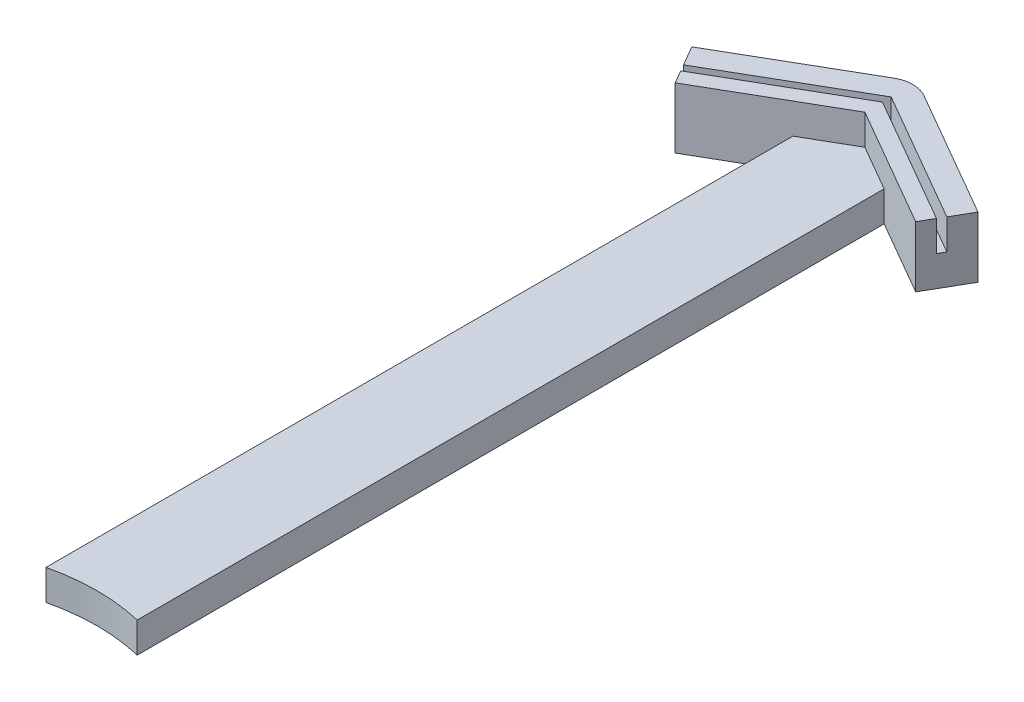
ISO-10303-21;
HEADER;
FILE_DESCRIPTION(('STEP AP214'),'2;1');
FILE_NAME('part.step','',(''),(''),'','','');
FILE_SCHEMA(('AUTOMOTIVE_DESIGN { 1 0 10303 214 1 1 1 1 }'));
ENDSEC;
DATA;
#1=APPLICATION_CONTEXT('core data for automotive mechanical design processes');
#2=APPLICATION_PROTOCOL_DEFINITION('international standard','automotive_design',2000,#1);
#3=PRODUCT_CONTEXT('',#1,'mechanical');
#4=PRODUCT('Part','Part','',(#3));
#5=PRODUCT_RELATED_PRODUCT_CATEGORY('part','',(#4));
#6=PRODUCT_DEFINITION_FORMATION('','',#4);
#7=PRODUCT_DEFINITION_CONTEXT('part definition',#1,'design');
#8=PRODUCT_DEFINITION('design','',#6,#7);
#9=PRODUCT_DEFINITION_SHAPE('','',#8);
#10=(LENGTH_UNIT() NAMED_UNIT(*) SI_UNIT(.MILLI.,.METRE.));
#11=(NAMED_UNIT(*) PLANE_ANGLE_UNIT() SI_UNIT($,.RADIAN.));
#12=(NAMED_UNIT(*) SI_UNIT($,.STERADIAN.) SOLID_ANGLE_UNIT());
#13=UNCERTAINTY_MEASURE_WITH_UNIT(LENGTH_MEASURE(1.E-05),#10,'distance_accuracy_value','');
#14=(GEOMETRIC_REPRESENTATION_CONTEXT(3) GLOBAL_UNCERTAINTY_ASSIGNED_CONTEXT((#13)) GLOBAL_UNIT_ASSIGNED_CONTEXT((#10,
#11,#12)) REPRESENTATION_CONTEXT('',''));
#15=CARTESIAN_POINT('',(0.,0.,0.));
#16=DIRECTION('',(0.,0.,1.));
#17=DIRECTION('',(1.,0.,0.));
#18=AXIS2_PLACEMENT_3D('',#15,#16,#17);
#19=CARTESIAN_POINT('',(0.,20.,34.6410161513775));
#20=DIRECTION('',(0.499999999999998,0.,-0.86602540378444));
#21=DIRECTION('',(-0.86602540378444,0.,-0.499999999999998));
#22=AXIS2_PLACEMENT_3D('',#19,#20,#21);
#23=PLANE('',#22);
#24=DIRECTION('',(0.86602540378444,0.,0.499999999999998));
#25=VECTOR('',#24,1.);
#26=CARTESIAN_POINT('',(0.,0.,34.6410161513775));
#27=LINE('',#26,#25);
#28=CARTESIAN_POINT('',(0.,0.,34.6410161513775));
#29=VERTEX_POINT('',#28);
#30=CARTESIAN_POINT('',(30.,0.,51.9615242270662));
#31=VERTEX_POINT('',#30);
#32=EDGE_CURVE('E120',#29,#31,#27,.T.);
#33=ORIENTED_EDGE('',*,*,#32,.F.);
#34=DIRECTION('',(0.,-1.,0.));
#35=VECTOR('',#34,1.);
#36=CARTESIAN_POINT('',(0.,20.,34.6410161513775));
#37=LINE('',#36,#35);
#38=CARTESIAN_POINT('',(0.,20.,34.6410161513775));
#39=VERTEX_POINT('',#38);
#40=EDGE_CURVE('E12',#39,#29,#37,.T.);
#41=ORIENTED_EDGE('',*,*,#40,.F.);
#42=DIRECTION('',(0.86602540378444,0.,0.499999999999998));
#43=VECTOR('',#42,1.);
#44=CARTESIAN_POINT('',(0.,20.,34.6410161513775));
#45=LINE('',#44,#43);
#46=CARTESIAN_POINT('',(30.,20.,51.9615242270662));
#47=VERTEX_POINT('',#46);
#48=EDGE_CURVE('E115',#39,#47,#45,.T.);
#49=ORIENTED_EDGE('',*,*,#48,.T.);
#50=DIRECTION('',(0.,-1.,0.));
#51=VECTOR('',#50,1.);
#52=CARTESIAN_POINT('',(30.,20.,51.9615242270662));
#53=LINE('',#52,#51);
#54=EDGE_CURVE('E46',#47,#31,#53,.T.);
#55=ORIENTED_EDGE('',*,*,#54,.T.);
#56=EDGE_LOOP('',(#33,#41,#49,#55));
#57=FACE_BOUND('',#56,.T.);
#58=ADVANCED_FACE('F43',(#57),#23,.T.);
#59=CARTESIAN_POINT('',(-30.,20.,51.9615242270662));
#60=DIRECTION('',(-0.499999999999998,0.,-0.86602540378444));
#61=DIRECTION('',(-0.86602540378444,0.,0.499999999999998));
#62=AXIS2_PLACEMENT_3D('',#59,#60,#61);
#63=PLANE('',#62);
#64=DIRECTION('',(0.86602540378444,0.,-0.499999999999998));
#65=VECTOR('',#64,1.);
#66=CARTESIAN_POINT('',(-30.,0.,51.9615242270662));
#67=LINE('',#66,#65);
#68=CARTESIAN_POINT('',(-30.,0.,51.9615242270662));
#69=VERTEX_POINT('',#68);
#70=EDGE_CURVE('E129',#69,#29,#67,.T.);
#71=ORIENTED_EDGE('',*,*,#70,.F.);
#72=DIRECTION('',(0.,-1.,0.));
#73=VECTOR('',#72,1.);
#74=CARTESIAN_POINT('',(-30.,20.,51.9615242270662));
#75=LINE('',#74,#73);
#76=CARTESIAN_POINT('',(-30.,20.,51.9615242270662));
#77=VERTEX_POINT('',#76);
#78=EDGE_CURVE('E52',#77,#69,#75,.T.);
#79=ORIENTED_EDGE('',*,*,#78,.F.);
#80=DIRECTION('',(0.86602540378444,0.,-0.499999999999998));
#81=VECTOR('',#80,1.);
#82=CARTESIAN_POINT('',(-30.,20.,51.9615242270662));
#83=LINE('',#82,#81);
#84=EDGE_CURVE('E110',#77,#39,#83,.T.);
#85=ORIENTED_EDGE('',*,*,#84,.T.);
#86=ORIENTED_EDGE('',*,*,#40,.T.);
#87=EDGE_LOOP('',(#71,#79,#85,#86));
#88=FACE_BOUND('',#87,.T.);
#89=ADVANCED_FACE('F135',(#88),#63,.T.);
#90=CARTESIAN_POINT('',(-30.,20.,51.9615242270662));
#91=DIRECTION('',(-1.,0.,0.));
#92=DIRECTION('',(0.,0.,1.));
#93=AXIS2_PLACEMENT_3D('',#90,#91,#92);
#94=PLANE('',#93);
#95=DIRECTION('',(0.,0.,-1.));
#96=VECTOR('',#95,1.);
#97=CARTESIAN_POINT('',(-30.,0.,51.9615242270662));
#98=LINE('',#97,#96);
#99=CARTESIAN_POINT('',(-30.,0.,543.23520585323));
#100=VERTEX_POINT('',#99);
#101=EDGE_CURVE('E99',#100,#69,#98,.T.);
#102=ORIENTED_EDGE('',*,*,#101,.F.);
#103=DIRECTION('',(0.,-1.,0.));
#104=VECTOR('',#103,1.);
#105=CARTESIAN_POINT('',(-30.,20.,543.23520585323));
#106=LINE('',#105,#104);
#107=CARTESIAN_POINT('',(-30.,20.,543.23520585323));
#108=VERTEX_POINT('',#107);
#109=EDGE_CURVE('E94',#108,#100,#106,.T.);
#110=ORIENTED_EDGE('',*,*,#109,.F.);
#111=DIRECTION('',(0.,0.,-1.));
#112=VECTOR('',#111,1.);
#113=CARTESIAN_POINT('',(-30.,20.,51.9615242270662));
#114=LINE('',#113,#112);
#115=EDGE_CURVE('E97',#108,#77,#114,.T.);
#116=ORIENTED_EDGE('',*,*,#115,.T.);
#117=ORIENTED_EDGE('',*,*,#78,.T.);
#118=EDGE_LOOP('',(#102,#110,#116,#117));
#119=FACE_BOUND('',#118,.T.);
#120=ADVANCED_FACE('F96',(#119),#94,.T.);
#121=CARTESIAN_POINT('',(0.,20.,669.726312259965));
#122=DIRECTION('',(0.,-1.,0.));
#123=DIRECTION('',(0.,0.,-1.));
#124=AXIS2_PLACEMENT_3D('',#121,#122,#123);
#125=CYLINDRICAL_SURFACE('',#124,130.);
#126=CARTESIAN_POINT('',(0.,0.,669.726312259965));
#127=DIRECTION('',(0.,1.,0.));
#128=DIRECTION('',(0.,0.,-1.));
#129=AXIS2_PLACEMENT_3D('',#126,#127,#128);
#130=CIRCLE('',#129,130.);
#131=CARTESIAN_POINT('',(30.,0.,543.23520585323));
#132=VERTEX_POINT('',#131);
#133=EDGE_CURVE('E126',#132,#100,#130,.T.);
#134=ORIENTED_EDGE('',*,*,#133,.F.);
#135=DIRECTION('',(0.,-1.,0.));
#136=VECTOR('',#135,1.);
#137=CARTESIAN_POINT('',(30.,20.,543.23520585323));
#138=LINE('',#137,#136);
#139=CARTESIAN_POINT('',(30.,20.,543.23520585323));
#140=VERTEX_POINT('',#139);
#141=EDGE_CURVE('E104',#140,#132,#138,.T.);
#142=ORIENTED_EDGE('',*,*,#141,.F.);
#143=CARTESIAN_POINT('',(0.,20.,669.726312259965));
#144=DIRECTION('',(0.,1.,0.));
#145=DIRECTION('',(0.,0.,-1.));
#146=AXIS2_PLACEMENT_3D('',#143,#144,#145);
#147=CIRCLE('',#146,130.);
#148=EDGE_CURVE('E109',#140,#108,#147,.T.);
#149=ORIENTED_EDGE('',*,*,#148,.T.);
#150=ORIENTED_EDGE('',*,*,#109,.T.);
#151=EDGE_LOOP('',(#134,#142,#149,#150));
#152=FACE_BOUND('',#151,.T.);
#153=ADVANCED_FACE('F112',(#152),#125,.F.);
#154=CARTESIAN_POINT('',(30.,20.,51.9615242270662));
#155=DIRECTION('',(1.,0.,0.));
#156=DIRECTION('',(0.,0.,-1.));
#157=AXIS2_PLACEMENT_3D('',#154,#155,#156);
#158=PLANE('',#157);
#159=DIRECTION('',(0.,0.,1.));
#160=VECTOR('',#159,1.);
#161=CARTESIAN_POINT('',(30.,0.,51.9615242270662));
#162=LINE('',#161,#160);
#163=EDGE_CURVE('E123',#31,#132,#162,.T.);
#164=ORIENTED_EDGE('',*,*,#163,.F.);
#165=ORIENTED_EDGE('',*,*,#54,.F.);
#166=DIRECTION('',(0.,0.,1.));
#167=VECTOR('',#166,1.);
#168=CARTESIAN_POINT('',(30.,20.,51.9615242270662));
#169=LINE('',#168,#167);
#170=EDGE_CURVE('E113',#47,#140,#169,.T.);
#171=ORIENTED_EDGE('',*,*,#170,.T.);
#172=ORIENTED_EDGE('',*,*,#141,.T.);
#173=EDGE_LOOP('',(#164,#165,#171,#172));
#174=FACE_BOUND('',#173,.T.);
#175=ADVANCED_FACE('F132',(#174),#158,.T.);
#176=CARTESIAN_POINT('',(0.,20.,669.726312259965));
#177=DIRECTION('',(0.,-1.,0.));
#178=DIRECTION('',(0.,0.,-1.));
#179=AXIS2_PLACEMENT_3D('',#176,#177,#178);
#180=PLANE('',#179);
#181=ORIENTED_EDGE('',*,*,#48,.F.);
#182=ORIENTED_EDGE('',*,*,#84,.F.);
#183=ORIENTED_EDGE('',*,*,#115,.F.);
#184=ORIENTED_EDGE('',*,*,#148,.F.);
#185=ORIENTED_EDGE('',*,*,#170,.F.);
#186=EDGE_LOOP('',(#181,#182,#183,#184,#185));
#187=FACE_BOUND('',#186,.T.);
#188=ADVANCED_FACE('F108',(#187),#180,.F.);
#189=CARTESIAN_POINT('',(0.,0.,669.726312259965));
#190=DIRECTION('',(0.,-1.,0.));
#191=DIRECTION('',(0.,0.,-1.));
#192=AXIS2_PLACEMENT_3D('',#189,#190,#191);
#193=PLANE('',#192);
#194=ORIENTED_EDGE('',*,*,#32,.T.);
#195=ORIENTED_EDGE('',*,*,#163,.T.);
#196=ORIENTED_EDGE('',*,*,#133,.T.);
#197=ORIENTED_EDGE('',*,*,#101,.T.);
#198=ORIENTED_EDGE('',*,*,#70,.T.);
#199=EDGE_LOOP('',(#194,#195,#196,#197,#198));
#200=FACE_BOUND('',#199,.T.);
#201=ADVANCED_FACE('F134',(#200),#193,.T.);
#202=CLOSED_SHELL('',(#58,#89,#120,#153,#175,#188,#201));
#203=MANIFOLD_SOLID_BREP('B2',#202);
#204=CARTESIAN_POINT('',(0.,40.,23.094010767585));
#205=DIRECTION('',(0.,1.,0.));
#206=DIRECTION('',(0.,0.,1.));
#207=AXIS2_PLACEMENT_3D('',#204,#205,#206);
#208=PLANE('',#207);
#209=DIRECTION('',(-0.866025403784439,0.,0.5));
#210=VECTOR('',#209,1.);
#211=CARTESIAN_POINT('',(-86.6027603816707,40.,67.3206350946107));
#212=LINE('',#211,#210);
#213=CARTESIAN_POINT('',(-2.20743562318049E-13,40.,17.3205080756886));
#214=VERTEX_POINT('',#213);
#215=CARTESIAN_POINT('',(-86.6027603816707,40.,67.3206350946107));
#216=VERTEX_POINT('',#215);
#217=EDGE_CURVE('E343',#214,#216,#212,.T.);
#218=ORIENTED_EDGE('',*,*,#217,.F.);
#219=DIRECTION('',(-0.86602540378444,0.,-0.499999999999998));
#220=VECTOR('',#219,1.);
#221=CARTESIAN_POINT('',(-2.20743562318049E-13,40.,17.3205080756886));
#222=LINE('',#221,#220);
#223=CARTESIAN_POINT('',(86.6027603816707,40.,67.3206350946107));
#224=VERTEX_POINT('',#223);
#225=EDGE_CURVE('E406',#224,#214,#222,.T.);
#226=ORIENTED_EDGE('',*,*,#225,.F.);
#227=DIRECTION('',(0.499999999999998,0.,-0.86602540378444));
#228=VECTOR('',#227,1.);
#229=CARTESIAN_POINT('',(79.1027603816707,40.,80.3110161513773));
#230=LINE('',#229,#228);
#231=CARTESIAN_POINT('',(94.1027603816707,40.,54.3302540378441));
#232=VERTEX_POINT('',#231);
#233=EDGE_CURVE('E256',#224,#232,#230,.T.);
#234=ORIENTED_EDGE('',*,*,#233,.T.);
#235=DIRECTION('',(-0.86602540378444,0.,-0.499999999999998));
#236=VECTOR('',#235,1.);
#237=CARTESIAN_POINT('',(10.,40.,5.77350269189625));
#238=LINE('',#237,#236);
#239=CARTESIAN_POINT('',(10.,40.,5.77350269189625));
#240=VERTEX_POINT('',#239);
#241=EDGE_CURVE('E417',#232,#240,#238,.T.);
#242=ORIENTED_EDGE('',*,*,#241,.T.);
#243=CARTESIAN_POINT('',(0.,40.,23.094010767585));
#244=DIRECTION('',(0.,1.,0.));
#245=DIRECTION('',(0.,0.,1.));
#246=AXIS2_PLACEMENT_3D('',#243,#244,#245);
#247=CIRCLE('',#246,20.);
#248=CARTESIAN_POINT('',(-10.,40.,5.77350269189625));
#249=VERTEX_POINT('',#248);
#250=EDGE_CURVE('E327',#240,#249,#247,.T.);
#251=ORIENTED_EDGE('',*,*,#250,.T.);
#252=DIRECTION('',(-0.86602540378444,0.,0.499999999999998));
#253=VECTOR('',#252,1.);
#254=CARTESIAN_POINT('',(-10.,40.,5.77350269189625));
#255=LINE('',#254,#253);
#256=CARTESIAN_POINT('',(-94.1027603816707,40.,54.3302540378441));
#257=VERTEX_POINT('',#256);
#258=EDGE_CURVE('E280',#249,#257,#255,.T.);
#259=ORIENTED_EDGE('',*,*,#258,.T.);
#260=DIRECTION('',(0.499999999999999,0.,0.866025403784439));
#261=VECTOR('',#260,1.);
#262=CARTESIAN_POINT('',(-94.1027603816707,40.,54.3302540378441));
#263=LINE('',#262,#261);
#264=EDGE_CURVE('E279',#257,#216,#263,.T.);
#265=ORIENTED_EDGE('',*,*,#264,.T.);
#266=EDGE_LOOP('',(#218,#226,#234,#242,#251,#259,#265));
#267=FACE_BOUND('',#266,.T.);
#268=ADVANCED_FACE('F193',(#267),#208,.T.);
#269=CARTESIAN_POINT('',(79.1027603816707,40.,80.3110161513773));
#270=DIRECTION('',(-0.86602540378444,0.,-0.499999999999998));
#271=DIRECTION('',(-0.499999999999998,0.,0.86602540378444));
#272=AXIS2_PLACEMENT_3D('',#269,#270,#271);
#273=PLANE('',#272);
#274=ORIENTED_EDGE('',*,*,#233,.F.);
#275=DIRECTION('',(0.,1.,0.));
#276=VECTOR('',#275,1.);
#277=CARTESIAN_POINT('',(86.6027603816707,20.,67.3206350946107));
#278=LINE('',#277,#276);
#279=CARTESIAN_POINT('',(86.6027603816707,20.,67.3206350946107));
#280=VERTEX_POINT('',#279);
#281=EDGE_CURVE('E411',#280,#224,#278,.T.);
#282=ORIENTED_EDGE('',*,*,#281,.F.);
#283=DIRECTION('',(0.500000000000001,0.,-0.866025403784438));
#284=VECTOR('',#283,1.);
#285=CARTESIAN_POINT('',(84.1027603816707,20.,71.6507621135329));
#286=LINE('',#285,#284);
#287=CARTESIAN_POINT('',(84.1027603816707,20.,71.6507621135329));
#288=VERTEX_POINT('',#287);
#289=EDGE_CURVE('E389',#288,#280,#286,.T.);
#290=ORIENTED_EDGE('',*,*,#289,.F.);
#291=DIRECTION('',(0.,1.,0.));
#292=VECTOR('',#291,1.);
#293=CARTESIAN_POINT('',(84.1027603816707,20.,71.6507621135329));
#294=LINE('',#293,#292);
#295=CARTESIAN_POINT('',(84.1027603816707,40.,71.6507621135329));
#296=VERTEX_POINT('',#295);
#297=EDGE_CURVE('E380',#288,#296,#294,.T.);
#298=ORIENTED_EDGE('',*,*,#297,.T.);
#299=CARTESIAN_POINT('',(79.1027603816707,40.,80.3110161513773));
#300=VERTEX_POINT('',#299);
#301=EDGE_CURVE('E415',#300,#296,#230,.T.);
#302=ORIENTED_EDGE('',*,*,#301,.F.);
#303=DIRECTION('',(0.,-1.,0.));
#304=VECTOR('',#303,1.);
#305=CARTESIAN_POINT('',(79.1027603816707,40.,80.3110161513773));
#306=LINE('',#305,#304);
#307=CARTESIAN_POINT('',(79.1027603816707,0.,80.3110161513773));
#308=VERTEX_POINT('',#307);
#309=EDGE_CURVE('E296',#300,#308,#306,.T.);
#310=ORIENTED_EDGE('',*,*,#309,.T.);
#311=DIRECTION('',(0.499999999999998,0.,-0.86602540378444));
#312=VECTOR('',#311,1.);
#313=CARTESIAN_POINT('',(79.1027603816707,0.,80.3110161513773));
#314=LINE('',#313,#312);
#315=CARTESIAN_POINT('',(94.1027603816707,0.,54.3302540378441));
#316=VERTEX_POINT('',#315);
#317=EDGE_CURVE('E301',#308,#316,#314,.T.);
#318=ORIENTED_EDGE('',*,*,#317,.T.);
#319=DIRECTION('',(0.,-1.,0.));
#320=VECTOR('',#319,1.);
#321=CARTESIAN_POINT('',(94.1027603816707,40.,54.3302540378441));
#322=LINE('',#321,#320);
#323=EDGE_CURVE('E41',#232,#316,#322,.T.);
#324=ORIENTED_EDGE('',*,*,#323,.F.);
#325=EDGE_LOOP('',(#274,#282,#290,#298,#302,#310,#318,#324));
#326=FACE_BOUND('',#325,.T.);
#327=ADVANCED_FACE('F195',(#326),#273,.F.);
#328=CARTESIAN_POINT('',(10.,40.,5.77350269189625));
#329=DIRECTION('',(-0.499999999999998,0.,0.86602540378444));
#330=DIRECTION('',(0.86602540378444,0.,0.499999999999998));
#331=AXIS2_PLACEMENT_3D('',#328,#329,#330);
#332=PLANE('',#331);
#333=DIRECTION('',(-0.86602540378444,0.,-0.499999999999998));
#334=VECTOR('',#333,1.);
#335=CARTESIAN_POINT('',(10.,0.,5.77350269189625));
#336=LINE('',#335,#334);
#337=CARTESIAN_POINT('',(10.,0.,5.77350269189625));
#338=VERTEX_POINT('',#337);
#339=EDGE_CURVE('E304',#316,#338,#336,.T.);
#340=ORIENTED_EDGE('',*,*,#339,.T.);
#341=DIRECTION('',(0.,-1.,0.));
#342=VECTOR('',#341,1.);
#343=CARTESIAN_POINT('',(10.,40.,5.77350269189625));
#344=LINE('',#343,#342);
#345=EDGE_CURVE('E201',#240,#338,#344,.T.);
#346=ORIENTED_EDGE('',*,*,#345,.F.);
#347=ORIENTED_EDGE('',*,*,#241,.F.);
#348=ORIENTED_EDGE('',*,*,#323,.T.);
#349=EDGE_LOOP('',(#340,#346,#347,#348));
#350=FACE_BOUND('',#349,.T.);
#351=ADVANCED_FACE('F420',(#350),#332,.F.);
#352=CARTESIAN_POINT('',(0.,40.,23.094010767585));
#353=DIRECTION('',(0.,-1.,0.));
#354=DIRECTION('',(0.,0.,-1.));
#355=AXIS2_PLACEMENT_3D('',#352,#353,#354);
#356=CYLINDRICAL_SURFACE('',#355,20.);
#357=CARTESIAN_POINT('',(0.,0.,23.094010767585));
#358=DIRECTION('',(0.,1.,0.));
#359=DIRECTION('',(0.,0.,1.));
#360=AXIS2_PLACEMENT_3D('',#357,#358,#359);
#361=CIRCLE('',#360,20.);
#362=CARTESIAN_POINT('',(-10.,0.,5.77350269189625));
#363=VERTEX_POINT('',#362);
#364=EDGE_CURVE('E307',#338,#363,#361,.T.);
#365=ORIENTED_EDGE('',*,*,#364,.T.);
#366=DIRECTION('',(0.,-1.,0.));
#367=VECTOR('',#366,1.);
#368=CARTESIAN_POINT('',(-10.,40.,5.77350269189625));
#369=LINE('',#368,#367);
#370=EDGE_CURVE('E318',#249,#363,#369,.T.);
#371=ORIENTED_EDGE('',*,*,#370,.F.);
#372=ORIENTED_EDGE('',*,*,#250,.F.);
#373=ORIENTED_EDGE('',*,*,#345,.T.);
#374=EDGE_LOOP('',(#365,#371,#372,#373));
#375=FACE_BOUND('',#374,.T.);
#376=ADVANCED_FACE('F325',(#375),#356,.T.);
#377=CARTESIAN_POINT('',(-10.,40.,5.77350269189625));
#378=DIRECTION('',(0.499999999999998,0.,0.86602540378444));
#379=DIRECTION('',(0.86602540378444,0.,-0.499999999999998));
#380=AXIS2_PLACEMENT_3D('',#377,#378,#379);
#381=PLANE('',#380);
#382=DIRECTION('',(-0.86602540378444,0.,0.499999999999998));
#383=VECTOR('',#382,1.);
#384=CARTESIAN_POINT('',(-10.,0.,5.77350269189625));
#385=LINE('',#384,#383);
#386=CARTESIAN_POINT('',(-94.1027603816707,0.,54.3302540378441));
#387=VERTEX_POINT('',#386);
#388=EDGE_CURVE('E309',#363,#387,#385,.T.);
#389=ORIENTED_EDGE('',*,*,#388,.T.);
#390=DIRECTION('',(0.,-1.,0.));
#391=VECTOR('',#390,1.);
#392=CARTESIAN_POINT('',(-94.1027603816707,40.,54.3302540378441));
#393=LINE('',#392,#391);
#394=EDGE_CURVE('E291',#257,#387,#393,.T.);
#395=ORIENTED_EDGE('',*,*,#394,.F.);
#396=ORIENTED_EDGE('',*,*,#258,.F.);
#397=ORIENTED_EDGE('',*,*,#370,.T.);
#398=EDGE_LOOP('',(#389,#395,#396,#397));
#399=FACE_BOUND('',#398,.T.);
#400=ADVANCED_FACE('F335',(#399),#381,.F.);
#401=CARTESIAN_POINT('',(-94.1027603816707,40.,54.3302540378441));
#402=DIRECTION('',(0.866025403784439,0.,-0.499999999999999));
#403=DIRECTION('',(-0.499999999999999,0.,-0.866025403784439));
#404=AXIS2_PLACEMENT_3D('',#401,#402,#403);
#405=PLANE('',#404);
#406=DIRECTION('',(0.5,0.,0.866025403784439));
#407=VECTOR('',#406,1.);
#408=CARTESIAN_POINT('',(-84.1027603816707,20.,71.6507621135329));
#409=LINE('',#408,#407);
#410=CARTESIAN_POINT('',(-86.6027603816707,20.,67.3206350946107));
#411=VERTEX_POINT('',#410);
#412=CARTESIAN_POINT('',(-84.1027603816707,20.,71.6507621135329));
#413=VERTEX_POINT('',#412);
#414=EDGE_CURVE('E393',#411,#413,#409,.T.);
#415=ORIENTED_EDGE('',*,*,#414,.F.);
#416=DIRECTION('',(0.,1.,0.));
#417=VECTOR('',#416,1.);
#418=CARTESIAN_POINT('',(-86.6027603816707,20.,67.3206350946107));
#419=LINE('',#418,#417);
#420=EDGE_CURVE('E305',#411,#216,#419,.T.);
#421=ORIENTED_EDGE('',*,*,#420,.T.);
#422=ORIENTED_EDGE('',*,*,#264,.F.);
#423=ORIENTED_EDGE('',*,*,#394,.T.);
#424=DIRECTION('',(0.499999999999999,0.,0.866025403784439));
#425=VECTOR('',#424,1.);
#426=CARTESIAN_POINT('',(-94.1027603816707,0.,54.3302540378441));
#427=LINE('',#426,#425);
#428=CARTESIAN_POINT('',(-79.1027603816707,0.,80.3110161513773));
#429=VERTEX_POINT('',#428);
#430=EDGE_CURVE('E288',#387,#429,#427,.T.);
#431=ORIENTED_EDGE('',*,*,#430,.T.);
#432=DIRECTION('',(0.,-1.,0.));
#433=VECTOR('',#432,1.);
#434=CARTESIAN_POINT('',(-79.1027603816707,40.,80.3110161513773));
#435=LINE('',#434,#433);
#436=CARTESIAN_POINT('',(-79.1027603816707,40.,80.3110161513773));
#437=VERTEX_POINT('',#436);
#438=EDGE_CURVE('E283',#437,#429,#435,.T.);
#439=ORIENTED_EDGE('',*,*,#438,.F.);
#440=CARTESIAN_POINT('',(-84.1027603816707,40.,71.6507621135329));
#441=VERTEX_POINT('',#440);
#442=EDGE_CURVE('E270',#441,#437,#263,.T.);
#443=ORIENTED_EDGE('',*,*,#442,.F.);
#444=DIRECTION('',(0.,1.,0.));
#445=VECTOR('',#444,1.);
#446=CARTESIAN_POINT('',(-84.1027603816707,20.,71.6507621135329));
#447=LINE('',#446,#445);
#448=EDGE_CURVE('E208',#413,#441,#447,.T.);
#449=ORIENTED_EDGE('',*,*,#448,.F.);
#450=EDGE_LOOP('',(#415,#421,#422,#423,#431,#439,#443,#449));
#451=FACE_BOUND('',#450,.T.);
#452=ADVANCED_FACE('F285',(#451),#405,.F.);
#453=CARTESIAN_POINT('',(-79.1027603816707,40.,80.3110161513773));
#454=DIRECTION('',(-0.499999999999998,0.,-0.86602540378444));
#455=DIRECTION('',(-0.86602540378444,0.,0.499999999999998));
#456=AXIS2_PLACEMENT_3D('',#453,#454,#455);
#457=PLANE('',#456);
#458=DIRECTION('',(0.86602540378444,0.,-0.499999999999998));
#459=VECTOR('',#458,1.);
#460=CARTESIAN_POINT('',(-79.1027603816707,0.,80.3110161513773));
#461=LINE('',#460,#459);
#462=CARTESIAN_POINT('',(0.,0.,34.6410161513775));
#463=VERTEX_POINT('',#462);
#464=EDGE_CURVE('E312',#429,#463,#461,.T.);
#465=ORIENTED_EDGE('',*,*,#464,.T.);
#466=DIRECTION('',(0.,-1.,0.));
#467=VECTOR('',#466,1.);
#468=CARTESIAN_POINT('',(0.,40.,34.6410161513775));
#469=LINE('',#468,#467);
#470=CARTESIAN_POINT('',(0.,40.,34.6410161513775));
#471=VERTEX_POINT('',#470);
#472=EDGE_CURVE('E292',#471,#463,#469,.T.);
#473=ORIENTED_EDGE('',*,*,#472,.F.);
#474=DIRECTION('',(0.86602540378444,0.,-0.499999999999998));
#475=VECTOR('',#474,1.);
#476=CARTESIAN_POINT('',(-79.1027603816707,40.,80.3110161513773));
#477=LINE('',#476,#475);
#478=EDGE_CURVE('E275',#437,#471,#477,.T.);
#479=ORIENTED_EDGE('',*,*,#478,.F.);
#480=ORIENTED_EDGE('',*,*,#438,.T.);
#481=EDGE_LOOP('',(#465,#473,#479,#480));
#482=FACE_BOUND('',#481,.T.);
#483=ADVANCED_FACE('F294',(#482),#457,.F.);
#484=CARTESIAN_POINT('',(0.,40.,34.6410161513775));
#485=DIRECTION('',(0.499999999999998,0.,-0.86602540378444));
#486=DIRECTION('',(-0.86602540378444,0.,-0.499999999999998));
#487=AXIS2_PLACEMENT_3D('',#484,#485,#486);
#488=PLANE('',#487);
#489=DIRECTION('',(0.86602540378444,0.,0.499999999999998));
#490=VECTOR('',#489,1.);
#491=CARTESIAN_POINT('',(0.,0.,34.6410161513775));
#492=LINE('',#491,#490);
#493=EDGE_CURVE('E247',#463,#308,#492,.T.);
#494=ORIENTED_EDGE('',*,*,#493,.T.);
#495=ORIENTED_EDGE('',*,*,#309,.F.);
#496=DIRECTION('',(0.86602540378444,0.,0.499999999999998));
#497=VECTOR('',#496,1.);
#498=CARTESIAN_POINT('',(0.,40.,34.6410161513775));
#499=LINE('',#498,#497);
#500=EDGE_CURVE('E217',#471,#300,#499,.T.);
#501=ORIENTED_EDGE('',*,*,#500,.F.);
#502=ORIENTED_EDGE('',*,*,#472,.T.);
#503=EDGE_LOOP('',(#494,#495,#501,#502));
#504=FACE_BOUND('',#503,.T.);
#505=ADVANCED_FACE('F424',(#504),#488,.F.);
#506=DIRECTION('',(0.86602540378444,0.,0.499999999999998));
#507=VECTOR('',#506,1.);
#508=CARTESIAN_POINT('',(0.,40.,23.094010767585));
#509=LINE('',#508,#507);
#510=CARTESIAN_POINT('',(0.,40.,23.094010767585));
#511=VERTEX_POINT('',#510);
#512=EDGE_CURVE('E404',#511,#296,#509,.T.);
#513=ORIENTED_EDGE('',*,*,#512,.F.);
#514=DIRECTION('',(0.86602540378444,0.,-0.499999999999998));
#515=VECTOR('',#514,1.);
#516=CARTESIAN_POINT('',(-84.1027603816707,40.,71.6507621135329));
#517=LINE('',#516,#515);
#518=EDGE_CURVE('E277',#441,#511,#517,.T.);
#519=ORIENTED_EDGE('',*,*,#518,.F.);
#520=ORIENTED_EDGE('',*,*,#442,.T.);
#521=ORIENTED_EDGE('',*,*,#478,.T.);
#522=ORIENTED_EDGE('',*,*,#500,.T.);
#523=ORIENTED_EDGE('',*,*,#301,.T.);
#524=EDGE_LOOP('',(#513,#519,#520,#521,#522,#523));
#525=FACE_BOUND('',#524,.T.);
#526=ADVANCED_FACE('F273',(#525),#208,.T.);
#527=CARTESIAN_POINT('',(0.,0.,23.094010767585));
#528=DIRECTION('',(0.,1.,0.));
#529=DIRECTION('',(0.,0.,1.));
#530=AXIS2_PLACEMENT_3D('',#527,#528,#529);
#531=PLANE('',#530);
#532=ORIENTED_EDGE('',*,*,#317,.F.);
#533=ORIENTED_EDGE('',*,*,#493,.F.);
#534=ORIENTED_EDGE('',*,*,#464,.F.);
#535=ORIENTED_EDGE('',*,*,#430,.F.);
#536=ORIENTED_EDGE('',*,*,#388,.F.);
#537=ORIENTED_EDGE('',*,*,#364,.F.);
#538=ORIENTED_EDGE('',*,*,#339,.F.);
#539=EDGE_LOOP('',(#532,#533,#534,#535,#536,#537,#538));
#540=FACE_BOUND('',#539,.T.);
#541=ADVANCED_FACE('F332',(#540),#531,.F.);
#542=CARTESIAN_POINT('',(-86.6027603816707,20.,67.3206350946107));
#543=DIRECTION('',(-0.5,0.,-0.866025403784439));
#544=DIRECTION('',(-0.866025403784439,0.,0.5));
#545=AXIS2_PLACEMENT_3D('',#542,#543,#544);
#546=PLANE('',#545);
#547=ORIENTED_EDGE('',*,*,#217,.T.);
#548=ORIENTED_EDGE('',*,*,#420,.F.);
#549=DIRECTION('',(-0.866025403784439,0.,0.5));
#550=VECTOR('',#549,1.);
#551=CARTESIAN_POINT('',(-86.6027603816707,20.,67.3206350946107));
#552=LINE('',#551,#550);
#553=CARTESIAN_POINT('',(-2.20743562318049E-13,20.,17.3205080756886));
#554=VERTEX_POINT('',#553);
#555=EDGE_CURVE('E401',#554,#411,#552,.T.);
#556=ORIENTED_EDGE('',*,*,#555,.F.);
#557=DIRECTION('',(0.,1.,0.));
#558=VECTOR('',#557,1.);
#559=CARTESIAN_POINT('',(-2.20743562318049E-13,20.,17.3205080756886));
#560=LINE('',#559,#558);
#561=EDGE_CURVE('E352',#554,#214,#560,.T.);
#562=ORIENTED_EDGE('',*,*,#561,.T.);
#563=EDGE_LOOP('',(#547,#548,#556,#562));
#564=FACE_BOUND('',#563,.T.);
#565=ADVANCED_FACE('F426',(#564),#546,.F.);
#566=CARTESIAN_POINT('',(-2.20743562318049E-13,20.,17.3205080756886));
#567=DIRECTION('',(0.499999999999998,0.,-0.86602540378444));
#568=DIRECTION('',(-0.86602540378444,0.,-0.499999999999998));
#569=AXIS2_PLACEMENT_3D('',#566,#567,#568);
#570=PLANE('',#569);
#571=ORIENTED_EDGE('',*,*,#225,.T.);
#572=ORIENTED_EDGE('',*,*,#561,.F.);
#573=DIRECTION('',(-0.86602540378444,0.,-0.499999999999998));
#574=VECTOR('',#573,1.);
#575=CARTESIAN_POINT('',(-2.20743562318049E-13,20.,17.3205080756886));
#576=LINE('',#575,#574);
#577=EDGE_CURVE('E398',#280,#554,#576,.T.);
#578=ORIENTED_EDGE('',*,*,#577,.F.);
#579=ORIENTED_EDGE('',*,*,#281,.T.);
#580=EDGE_LOOP('',(#571,#572,#578,#579));
#581=FACE_BOUND('',#580,.T.);
#582=ADVANCED_FACE('F428',(#581),#570,.F.);
#583=CARTESIAN_POINT('',(0.,20.,23.094010767585));
#584=DIRECTION('',(-0.499999999999998,0.,0.86602540378444));
#585=DIRECTION('',(0.86602540378444,0.,0.499999999999998));
#586=AXIS2_PLACEMENT_3D('',#583,#584,#585);
#587=PLANE('',#586);
#588=ORIENTED_EDGE('',*,*,#512,.T.);
#589=ORIENTED_EDGE('',*,*,#297,.F.);
#590=DIRECTION('',(0.86602540378444,0.,0.499999999999998));
#591=VECTOR('',#590,1.);
#592=CARTESIAN_POINT('',(0.,20.,23.094010767585));
#593=LINE('',#592,#591);
#594=CARTESIAN_POINT('',(0.,20.,23.094010767585));
#595=VERTEX_POINT('',#594);
#596=EDGE_CURVE('E383',#595,#288,#593,.T.);
#597=ORIENTED_EDGE('',*,*,#596,.F.);
#598=DIRECTION('',(0.,1.,0.));
#599=VECTOR('',#598,1.);
#600=CARTESIAN_POINT('',(0.,20.,23.094010767585));
#601=LINE('',#600,#599);
#602=EDGE_CURVE('E373',#595,#511,#601,.T.);
#603=ORIENTED_EDGE('',*,*,#602,.T.);
#604=EDGE_LOOP('',(#588,#589,#597,#603));
#605=FACE_BOUND('',#604,.T.);
#606=ADVANCED_FACE('F384',(#605),#587,.F.);
#607=CARTESIAN_POINT('',(-84.1027603816707,20.,71.6507621135329));
#608=DIRECTION('',(0.499999999999998,0.,0.86602540378444));
#609=DIRECTION('',(0.86602540378444,0.,-0.499999999999998));
#610=AXIS2_PLACEMENT_3D('',#607,#608,#609);
#611=PLANE('',#610);
#612=ORIENTED_EDGE('',*,*,#518,.T.);
#613=ORIENTED_EDGE('',*,*,#602,.F.);
#614=DIRECTION('',(0.86602540378444,0.,-0.499999999999998));
#615=VECTOR('',#614,1.);
#616=CARTESIAN_POINT('',(-84.1027603816707,20.,71.6507621135329));
#617=LINE('',#616,#615);
#618=EDGE_CURVE('E377',#413,#595,#617,.T.);
#619=ORIENTED_EDGE('',*,*,#618,.F.);
#620=ORIENTED_EDGE('',*,*,#448,.T.);
#621=EDGE_LOOP('',(#612,#613,#619,#620));
#622=FACE_BOUND('',#621,.T.);
#623=ADVANCED_FACE('F375',(#622),#611,.F.);
#624=CARTESIAN_POINT('',(0.,20.,0.));
#625=DIRECTION('',(0.,-1.,0.));
#626=DIRECTION('',(0.,0.,-1.));
#627=AXIS2_PLACEMENT_3D('',#624,#625,#626);
#628=PLANE('',#627);
#629=ORIENTED_EDGE('',*,*,#414,.T.);
#630=ORIENTED_EDGE('',*,*,#618,.T.);
#631=ORIENTED_EDGE('',*,*,#596,.T.);
#632=ORIENTED_EDGE('',*,*,#289,.T.);
#633=ORIENTED_EDGE('',*,*,#577,.T.);
#634=ORIENTED_EDGE('',*,*,#555,.T.);
#635=EDGE_LOOP('',(#629,#630,#631,#632,#633,#634));
#636=FACE_BOUND('',#635,.T.);
#637=ADVANCED_FACE('F391',(#636),#628,.F.);
#638=CLOSED_SHELL('',(#268,#327,#351,#376,#400,#452,#483,#505,#526,#541,#565,#582,#606,#623,#637));
#639=MANIFOLD_SOLID_BREP('B6',#638);
#640=ADVANCED_BREP_SHAPE_REPRESENTATION('',(#18,#203,#639),#14);
#641=SHAPE_DEFINITION_REPRESENTATION(#9,#640);
ENDSEC;
END-ISO-10303-21;
